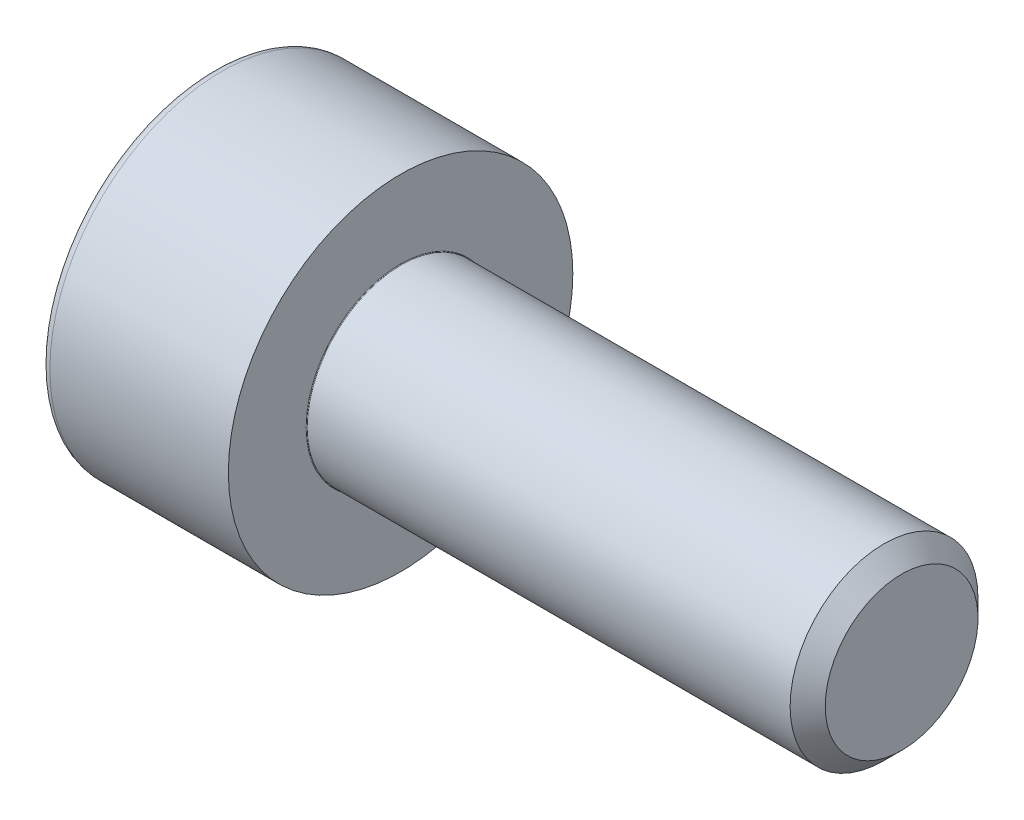
ISO-10303-21;
HEADER;
FILE_DESCRIPTION(('STEP AP214'),'2;1');
FILE_NAME('part.step','',(''),(''),'','','');
FILE_SCHEMA(('AUTOMOTIVE_DESIGN { 1 0 10303 214 1 1 1 1 }'));
ENDSEC;
DATA;
#1=APPLICATION_CONTEXT('core data for automotive mechanical design processes');
#2=APPLICATION_PROTOCOL_DEFINITION('international standard','automotive_design',2000,#1);
#3=PRODUCT_CONTEXT('',#1,'mechanical');
#4=PRODUCT('Part','Part','',(#3));
#5=PRODUCT_RELATED_PRODUCT_CATEGORY('part','',(#4));
#6=PRODUCT_DEFINITION_FORMATION('','',#4);
#7=PRODUCT_DEFINITION_CONTEXT('part definition',#1,'design');
#8=PRODUCT_DEFINITION('design','',#6,#7);
#9=PRODUCT_DEFINITION_SHAPE('','',#8);
#10=(LENGTH_UNIT() NAMED_UNIT(*) SI_UNIT(.MILLI.,.METRE.));
#11=(NAMED_UNIT(*) PLANE_ANGLE_UNIT() SI_UNIT($,.RADIAN.));
#12=(NAMED_UNIT(*) SI_UNIT($,.STERADIAN.) SOLID_ANGLE_UNIT());
#13=UNCERTAINTY_MEASURE_WITH_UNIT(LENGTH_MEASURE(1.E-05),#10,'distance_accuracy_value','');
#14=(GEOMETRIC_REPRESENTATION_CONTEXT(3) GLOBAL_UNCERTAINTY_ASSIGNED_CONTEXT((#13)) GLOBAL_UNIT_ASSIGNED_CONTEXT((#10,
#11,#12)) REPRESENTATION_CONTEXT('',''));
#15=CARTESIAN_POINT('',(0.,0.,0.));
#16=DIRECTION('',(0.,0.,1.));
#17=DIRECTION('',(1.,0.,0.));
#18=AXIS2_PLACEMENT_3D('',#15,#16,#17);
#19=CARTESIAN_POINT('',(0.,0.,0.));
#20=DIRECTION('',(-1.,0.,0.));
#21=DIRECTION('',(0.,0.,1.));
#22=AXIS2_PLACEMENT_3D('',#19,#20,#21);
#23=PLANE('',#22);
#24=DIRECTION('',(0.,-0.5,0.866025403784438));
#25=VECTOR('',#24,1.);
#26=CARTESIAN_POINT('',(0.,1.47801668912544,0.));
#27=LINE('',#26,#25);
#28=CARTESIAN_POINT('',(0.,1.47801668912544,0.));
#29=VERTEX_POINT('',#28);
#30=CARTESIAN_POINT('',(0.,0.739008344562721,1.28));
#31=VERTEX_POINT('',#30);
#32=EDGE_CURVE('E265',#29,#31,#27,.T.);
#33=ORIENTED_EDGE('',*,*,#32,.T.);
#34=DIRECTION('',(0.,1.,0.));
#35=VECTOR('',#34,1.);
#36=CARTESIAN_POINT('',(0.,-0.739008344562722,1.28));
#37=LINE('',#36,#35);
#38=CARTESIAN_POINT('',(0.,-0.739008344562722,1.28));
#39=VERTEX_POINT('',#38);
#40=EDGE_CURVE('E137',#39,#31,#37,.T.);
#41=ORIENTED_EDGE('',*,*,#40,.F.);
#42=DIRECTION('',(0.,-0.500000000000001,-0.866025403784438));
#43=VECTOR('',#42,1.);
#44=CARTESIAN_POINT('',(0.,-0.739008344562722,1.28));
#45=LINE('',#44,#43);
#46=CARTESIAN_POINT('',(0.,-1.47801668912545,0.));
#47=VERTEX_POINT('',#46);
#48=EDGE_CURVE('E268',#39,#47,#45,.T.);
#49=ORIENTED_EDGE('',*,*,#48,.T.);
#50=DIRECTION('',(0.,0.5,-0.866025403784438));
#51=VECTOR('',#50,1.);
#52=CARTESIAN_POINT('',(0.,-1.47801668912545,0.));
#53=LINE('',#52,#51);
#54=CARTESIAN_POINT('',(0.,-0.739008344562723,-1.28));
#55=VERTEX_POINT('',#54);
#56=EDGE_CURVE('E271',#47,#55,#53,.T.);
#57=ORIENTED_EDGE('',*,*,#56,.T.);
#58=DIRECTION('',(0.,-1.,0.));
#59=VECTOR('',#58,1.);
#60=CARTESIAN_POINT('',(0.,0.739008344562719,-1.28));
#61=LINE('',#60,#59);
#62=CARTESIAN_POINT('',(0.,0.739008344562719,-1.28));
#63=VERTEX_POINT('',#62);
#64=EDGE_CURVE('E274',#63,#55,#61,.T.);
#65=ORIENTED_EDGE('',*,*,#64,.F.);
#66=DIRECTION('',(0.,-0.500000000000001,-0.866025403784438));
#67=VECTOR('',#66,1.);
#68=CARTESIAN_POINT('',(0.,1.47801668912544,0.));
#69=LINE('',#68,#67);
#70=EDGE_CURVE('E132',#29,#63,#69,.T.);
#71=ORIENTED_EDGE('',*,*,#70,.F.);
#72=EDGE_LOOP('',(#33,#41,#49,#57,#65,#71));
#73=FACE_BOUND('',#72,.T.);
#74=CARTESIAN_POINT('',(0.,0.,0.));
#75=DIRECTION('',(-1.,0.,0.));
#76=DIRECTION('',(0.,0.,1.));
#77=AXIS2_PLACEMENT_3D('',#74,#75,#76);
#78=CIRCLE('',#77,2.6);
#79=CARTESIAN_POINT('',(0.,0.,2.6));
#80=VERTEX_POINT('',#79);
#81=EDGE_CURVE('E49',#80,#80,#78,.T.);
#82=ORIENTED_EDGE('',*,*,#81,.T.);
#83=EDGE_LOOP('',(#82));
#84=FACE_BOUND('',#83,.T.);
#85=ADVANCED_FACE('F41',(#73,#84),#23,.T.);
#86=CARTESIAN_POINT('',(-31.75,0.,0.));
#87=DIRECTION('',(-1.,0.,0.));
#88=DIRECTION('',(0.,0.,1.));
#89=AXIS2_PLACEMENT_3D('',#86,#87,#88);
#90=CYLINDRICAL_SURFACE('',#89,2.75);
#91=CARTESIAN_POINT('',(0.149999999999997,0.,0.));
#92=DIRECTION('',(-1.,0.,0.));
#93=DIRECTION('',(0.,0.,1.));
#94=AXIS2_PLACEMENT_3D('',#91,#92,#93);
#95=CIRCLE('',#94,2.75);
#96=CARTESIAN_POINT('',(0.149999999999997,0.,2.75));
#97=VERTEX_POINT('',#96);
#98=EDGE_CURVE('E11',#97,#97,#95,.F.);
#99=ORIENTED_EDGE('',*,*,#98,.T.);
#100=EDGE_LOOP('',(#99));
#101=FACE_BOUND('',#100,.T.);
#102=CARTESIAN_POINT('',(3.,0.,0.));
#103=DIRECTION('',(-1.,0.,0.));
#104=DIRECTION('',(0.,0.,1.));
#105=AXIS2_PLACEMENT_3D('',#102,#103,#104);
#106=CIRCLE('',#105,2.75);
#107=CARTESIAN_POINT('',(3.,0.,2.75));
#108=VERTEX_POINT('',#107);
#109=EDGE_CURVE('E155',#108,#108,#106,.T.);
#110=ORIENTED_EDGE('',*,*,#109,.T.);
#111=EDGE_LOOP('',(#110));
#112=FACE_BOUND('',#111,.T.);
#113=ADVANCED_FACE('F180',(#101,#112),#90,.T.);
#114=CARTESIAN_POINT('',(3.,2.75,0.));
#115=DIRECTION('',(1.,0.,0.));
#116=DIRECTION('',(0.,0.,-1.));
#117=AXIS2_PLACEMENT_3D('',#114,#115,#116);
#118=PLANE('',#117);
#119=CARTESIAN_POINT('',(3.,0.,0.));
#120=DIRECTION('',(1.,0.,0.));
#121=DIRECTION('',(0.,0.,-1.));
#122=AXIS2_PLACEMENT_3D('',#119,#120,#121);
#123=CIRCLE('',#122,1.51);
#124=CARTESIAN_POINT('',(3.,0.,-1.51));
#125=VERTEX_POINT('',#124);
#126=EDGE_CURVE('E158',#125,#125,#123,.F.);
#127=ORIENTED_EDGE('',*,*,#126,.T.);
#128=EDGE_LOOP('',(#127));
#129=FACE_BOUND('',#128,.T.);
#130=ORIENTED_EDGE('',*,*,#109,.F.);
#131=EDGE_LOOP('',(#130));
#132=FACE_BOUND('',#131,.T.);
#133=ADVANCED_FACE('F185',(#129,#132),#118,.T.);
#134=CARTESIAN_POINT('',(-31.75,0.,0.));
#135=DIRECTION('',(-1.,0.,0.));
#136=DIRECTION('',(0.,0.,1.));
#137=AXIS2_PLACEMENT_3D('',#134,#135,#136);
#138=CYLINDRICAL_SURFACE('',#137,1.5);
#139=CARTESIAN_POINT('',(3.01,0.,0.));
#140=DIRECTION('',(1.,0.,0.));
#141=DIRECTION('',(0.,0.,-1.));
#142=AXIS2_PLACEMENT_3D('',#139,#140,#141);
#143=CIRCLE('',#142,1.5);
#144=CARTESIAN_POINT('',(3.01,0.,-1.5));
#145=VERTEX_POINT('',#144);
#146=EDGE_CURVE('E161',#145,#145,#143,.T.);
#147=ORIENTED_EDGE('',*,*,#146,.T.);
#148=EDGE_LOOP('',(#147));
#149=FACE_BOUND('',#148,.T.);
#150=CARTESIAN_POINT('',(10.7195,0.,0.));
#151=DIRECTION('',(-1.,0.,0.));
#152=DIRECTION('',(0.,0.,1.));
#153=AXIS2_PLACEMENT_3D('',#150,#151,#152);
#154=CIRCLE('',#153,1.5);
#155=CARTESIAN_POINT('',(10.7195,0.,1.5));
#156=VERTEX_POINT('',#155);
#157=EDGE_CURVE('E152',#156,#156,#154,.T.);
#158=ORIENTED_EDGE('',*,*,#157,.T.);
#159=EDGE_LOOP('',(#158));
#160=FACE_BOUND('',#159,.T.);
#161=ADVANCED_FACE('F191',(#149,#160),#138,.T.);
#162=CARTESIAN_POINT('',(11.,0.,0.));
#163=DIRECTION('',(-1.,0.,0.));
#164=DIRECTION('',(0.,0.,1.));
#165=AXIS2_PLACEMENT_3D('',#162,#163,#164);
#166=CONICAL_SURFACE('',#165,1.2195,0.785398163397467);
#167=ORIENTED_EDGE('',*,*,#157,.F.);
#168=EDGE_LOOP('',(#167));
#169=FACE_BOUND('',#168,.T.);
#170=CARTESIAN_POINT('',(11.,0.,0.));
#171=DIRECTION('',(-1.,0.,0.));
#172=DIRECTION('',(0.,0.,1.));
#173=AXIS2_PLACEMENT_3D('',#170,#171,#172);
#174=CIRCLE('',#173,1.2195);
#175=CARTESIAN_POINT('',(11.,0.,1.2195));
#176=VERTEX_POINT('',#175);
#177=EDGE_CURVE('E148',#176,#176,#174,.T.);
#178=ORIENTED_EDGE('',*,*,#177,.T.);
#179=EDGE_LOOP('',(#178));
#180=FACE_BOUND('',#179,.T.);
#181=ADVANCED_FACE('F195',(#169,#180),#166,.T.);
#182=CARTESIAN_POINT('',(11.,1.2195,0.));
#183=DIRECTION('',(1.,0.,0.));
#184=DIRECTION('',(0.,0.,-1.));
#185=AXIS2_PLACEMENT_3D('',#182,#183,#184);
#186=PLANE('',#185);
#187=ORIENTED_EDGE('',*,*,#177,.F.);
#188=EDGE_LOOP('',(#187));
#189=FACE_BOUND('',#188,.T.);
#190=ADVANCED_FACE('F177',(#189),#186,.T.);
#191=CARTESIAN_POINT('',(3.01,0.,0.));
#192=DIRECTION('',(1.,0.,0.));
#193=DIRECTION('',(0.,0.,-1.));
#194=AXIS2_PLACEMENT_3D('',#191,#192,#193);
#195=TOROIDAL_SURFACE('',#194,1.51,0.01);
#196=ORIENTED_EDGE('',*,*,#146,.F.);
#197=EDGE_LOOP('',(#196));
#198=FACE_BOUND('',#197,.T.);
#199=ORIENTED_EDGE('',*,*,#126,.F.);
#200=EDGE_LOOP('',(#199));
#201=FACE_BOUND('',#200,.T.);
#202=ADVANCED_FACE('F168',(#198,#201),#195,.F.);
#203=CARTESIAN_POINT('',(0.149999999999997,0.,0.));
#204=DIRECTION('',(-1.,0.,0.));
#205=DIRECTION('',(0.,0.,1.));
#206=AXIS2_PLACEMENT_3D('',#203,#204,#205);
#207=TOROIDAL_SURFACE('',#206,2.6,0.15);
#208=ORIENTED_EDGE('',*,*,#98,.F.);
#209=EDGE_LOOP('',(#208));
#210=FACE_BOUND('',#209,.T.);
#211=ORIENTED_EDGE('',*,*,#81,.F.);
#212=EDGE_LOOP('',(#211));
#213=FACE_BOUND('',#212,.T.);
#214=ADVANCED_FACE('F43',(#210,#213),#207,.T.);
#215=CARTESIAN_POINT('',(1.3,1.47801668912544,0.));
#216=DIRECTION('',(0.,-0.866025403784438,-0.5));
#217=DIRECTION('',(0.,0.5,-0.866025403784439));
#218=AXIS2_PLACEMENT_3D('',#215,#216,#217);
#219=PLANE('',#218);
#220=ORIENTED_EDGE('',*,*,#32,.F.);
#221=DIRECTION('',(-1.,0.,0.));
#222=VECTOR('',#221,1.);
#223=CARTESIAN_POINT('',(1.3,1.47801668912544,0.));
#224=LINE('',#223,#222);
#225=CARTESIAN_POINT('',(1.3,1.47801668912544,0.));
#226=VERTEX_POINT('',#225);
#227=EDGE_CURVE('E255',#226,#29,#224,.T.);
#228=ORIENTED_EDGE('',*,*,#227,.F.);
#229=DIRECTION('',(0.,-0.5,0.866025403784438));
#230=VECTOR('',#229,1.);
#231=CARTESIAN_POINT('',(1.3,1.47801668912544,0.));
#232=LINE('',#231,#230);
#233=CARTESIAN_POINT('',(1.3,1.10851251684408,0.64));
#234=VERTEX_POINT('',#233);
#235=EDGE_CURVE('E124',#226,#234,#232,.T.);
#236=ORIENTED_EDGE('',*,*,#235,.T.);
#237=CARTESIAN_POINT('',(1.3,0.739008344562721,1.28));
#238=VERTEX_POINT('',#237);
#239=EDGE_CURVE('E115',#234,#238,#232,.T.);
#240=ORIENTED_EDGE('',*,*,#239,.T.);
#241=DIRECTION('',(-1.,0.,0.));
#242=VECTOR('',#241,1.);
#243=CARTESIAN_POINT('',(1.3,0.739008344562721,1.28));
#244=LINE('',#243,#242);
#245=EDGE_CURVE('E129',#238,#31,#244,.T.);
#246=ORIENTED_EDGE('',*,*,#245,.T.);
#247=EDGE_LOOP('',(#220,#228,#236,#240,#246));
#248=FACE_BOUND('',#247,.T.);
#249=ADVANCED_FACE('F128',(#248),#219,.T.);
#250=CARTESIAN_POINT('',(1.3,-0.739008344562722,1.28));
#251=DIRECTION('',(0.,0.,1.));
#252=DIRECTION('',(0.,-1.,0.));
#253=AXIS2_PLACEMENT_3D('',#250,#251,#252);
#254=PLANE('',#253);
#255=ORIENTED_EDGE('',*,*,#40,.T.);
#256=ORIENTED_EDGE('',*,*,#245,.F.);
#257=DIRECTION('',(0.,1.,0.));
#258=VECTOR('',#257,1.);
#259=CARTESIAN_POINT('',(1.3,-0.739008344562722,1.28));
#260=LINE('',#259,#258);
#261=CARTESIAN_POINT('',(1.3,0.,1.28));
#262=VERTEX_POINT('',#261);
#263=EDGE_CURVE('E112',#262,#238,#260,.T.);
#264=ORIENTED_EDGE('',*,*,#263,.F.);
#265=CARTESIAN_POINT('',(1.3,-0.739008344562722,1.28));
#266=VERTEX_POINT('',#265);
#267=EDGE_CURVE('E123',#266,#262,#260,.T.);
#268=ORIENTED_EDGE('',*,*,#267,.F.);
#269=DIRECTION('',(-1.,0.,0.));
#270=VECTOR('',#269,1.);
#271=CARTESIAN_POINT('',(1.3,-0.739008344562722,1.28));
#272=LINE('',#271,#270);
#273=EDGE_CURVE('E139',#266,#39,#272,.T.);
#274=ORIENTED_EDGE('',*,*,#273,.T.);
#275=EDGE_LOOP('',(#255,#256,#264,#268,#274));
#276=FACE_BOUND('',#275,.T.);
#277=ADVANCED_FACE('F134',(#276),#254,.F.);
#278=CARTESIAN_POINT('',(1.3,-0.739008344562722,1.28));
#279=DIRECTION('',(0.,0.866025403784438,-0.500000000000001));
#280=DIRECTION('',(0.,0.500000000000001,0.866025403784438));
#281=AXIS2_PLACEMENT_3D('',#278,#279,#280);
#282=PLANE('',#281);
#283=ORIENTED_EDGE('',*,*,#48,.F.);
#284=ORIENTED_EDGE('',*,*,#273,.F.);
#285=DIRECTION('',(0.,-0.500000000000001,-0.866025403784438));
#286=VECTOR('',#285,1.);
#287=CARTESIAN_POINT('',(1.3,-0.739008344562722,1.28));
#288=LINE('',#287,#286);
#289=CARTESIAN_POINT('',(1.3,-1.10851251684408,0.640000000000003));
#290=VERTEX_POINT('',#289);
#291=EDGE_CURVE('E294',#266,#290,#288,.T.);
#292=ORIENTED_EDGE('',*,*,#291,.T.);
#293=CARTESIAN_POINT('',(1.3,-1.47801668912545,0.));
#294=VERTEX_POINT('',#293);
#295=EDGE_CURVE('E283',#290,#294,#288,.T.);
#296=ORIENTED_EDGE('',*,*,#295,.T.);
#297=DIRECTION('',(-1.,0.,0.));
#298=VECTOR('',#297,1.);
#299=CARTESIAN_POINT('',(1.3,-1.47801668912545,0.));
#300=LINE('',#299,#298);
#301=EDGE_CURVE('E144',#294,#47,#300,.T.);
#302=ORIENTED_EDGE('',*,*,#301,.T.);
#303=EDGE_LOOP('',(#283,#284,#292,#296,#302));
#304=FACE_BOUND('',#303,.T.);
#305=ADVANCED_FACE('F209',(#304),#282,.T.);
#306=CARTESIAN_POINT('',(1.3,-1.47801668912545,0.));
#307=DIRECTION('',(0.,0.866025403784438,0.5));
#308=DIRECTION('',(0.,-0.5,0.866025403784439));
#309=AXIS2_PLACEMENT_3D('',#306,#307,#308);
#310=PLANE('',#309);
#311=ORIENTED_EDGE('',*,*,#56,.F.);
#312=ORIENTED_EDGE('',*,*,#301,.F.);
#313=DIRECTION('',(0.,0.5,-0.866025403784438));
#314=VECTOR('',#313,1.);
#315=CARTESIAN_POINT('',(1.3,-1.47801668912545,0.));
#316=LINE('',#315,#314);
#317=CARTESIAN_POINT('',(1.3,-1.10851251684408,-0.640000000000001));
#318=VERTEX_POINT('',#317);
#319=EDGE_CURVE('E261',#294,#318,#316,.T.);
#320=ORIENTED_EDGE('',*,*,#319,.T.);
#321=CARTESIAN_POINT('',(1.3,-0.739008344562723,-1.28));
#322=VERTEX_POINT('',#321);
#323=EDGE_CURVE('E293',#318,#322,#316,.T.);
#324=ORIENTED_EDGE('',*,*,#323,.T.);
#325=DIRECTION('',(-1.,0.,0.));
#326=VECTOR('',#325,1.);
#327=CARTESIAN_POINT('',(1.3,-0.739008344562723,-1.28));
#328=LINE('',#327,#326);
#329=EDGE_CURVE('E254',#322,#55,#328,.T.);
#330=ORIENTED_EDGE('',*,*,#329,.T.);
#331=EDGE_LOOP('',(#311,#312,#320,#324,#330));
#332=FACE_BOUND('',#331,.T.);
#333=ADVANCED_FACE('F212',(#332),#310,.T.);
#334=CARTESIAN_POINT('',(1.3,0.739008344562719,-1.28));
#335=DIRECTION('',(0.,0.,-1.));
#336=DIRECTION('',(0.,1.,0.));
#337=AXIS2_PLACEMENT_3D('',#334,#335,#336);
#338=PLANE('',#337);
#339=ORIENTED_EDGE('',*,*,#64,.T.);
#340=ORIENTED_EDGE('',*,*,#329,.F.);
#341=DIRECTION('',(0.,-1.,0.));
#342=VECTOR('',#341,1.);
#343=CARTESIAN_POINT('',(1.3,0.739008344562719,-1.28));
#344=LINE('',#343,#342);
#345=CARTESIAN_POINT('',(1.3,0.,-1.28));
#346=VERTEX_POINT('',#345);
#347=EDGE_CURVE('E258',#346,#322,#344,.T.);
#348=ORIENTED_EDGE('',*,*,#347,.F.);
#349=CARTESIAN_POINT('',(1.3,0.739008344562719,-1.28));
#350=VERTEX_POINT('',#349);
#351=EDGE_CURVE('E56',#350,#346,#344,.T.);
#352=ORIENTED_EDGE('',*,*,#351,.F.);
#353=DIRECTION('',(-1.,0.,0.));
#354=VECTOR('',#353,1.);
#355=CARTESIAN_POINT('',(1.3,0.739008344562719,-1.28));
#356=LINE('',#355,#354);
#357=EDGE_CURVE('E251',#350,#63,#356,.T.);
#358=ORIENTED_EDGE('',*,*,#357,.T.);
#359=EDGE_LOOP('',(#339,#340,#348,#352,#358));
#360=FACE_BOUND('',#359,.T.);
#361=ADVANCED_FACE('F216',(#360),#338,.F.);
#362=CARTESIAN_POINT('',(1.3,1.47801668912544,0.));
#363=DIRECTION('',(0.,0.866025403784438,-0.500000000000001));
#364=DIRECTION('',(0.,0.500000000000001,0.866025403784438));
#365=AXIS2_PLACEMENT_3D('',#362,#363,#364);
#366=PLANE('',#365);
#367=ORIENTED_EDGE('',*,*,#70,.T.);
#368=ORIENTED_EDGE('',*,*,#357,.F.);
#369=DIRECTION('',(0.,-0.500000000000001,-0.866025403784438));
#370=VECTOR('',#369,1.);
#371=CARTESIAN_POINT('',(1.3,1.47801668912544,0.));
#372=LINE('',#371,#370);
#373=CARTESIAN_POINT('',(1.3,1.10851251684408,-0.640000000000002));
#374=VERTEX_POINT('',#373);
#375=EDGE_CURVE('E241',#374,#350,#372,.T.);
#376=ORIENTED_EDGE('',*,*,#375,.F.);
#377=EDGE_CURVE('E247',#226,#374,#372,.T.);
#378=ORIENTED_EDGE('',*,*,#377,.F.);
#379=ORIENTED_EDGE('',*,*,#227,.T.);
#380=EDGE_LOOP('',(#367,#368,#376,#378,#379));
#381=FACE_BOUND('',#380,.T.);
#382=ADVANCED_FACE('F220',(#381),#366,.F.);
#383=CARTESIAN_POINT('',(1.3,1.47801668912544,0.));
#384=DIRECTION('',(1.,0.,0.));
#385=DIRECTION('',(0.,0.,-1.));
#386=AXIS2_PLACEMENT_3D('',#383,#384,#385);
#387=PLANE('',#386);
#388=ORIENTED_EDGE('',*,*,#347,.T.);
#389=ORIENTED_EDGE('',*,*,#323,.F.);
#390=CARTESIAN_POINT('',(1.3,0.,0.));
#391=DIRECTION('',(-1.,0.,0.));
#392=DIRECTION('',(0.,0.,1.));
#393=AXIS2_PLACEMENT_3D('',#390,#391,#392);
#394=CIRCLE('',#393,1.28);
#395=EDGE_CURVE('E289',#346,#318,#394,.T.);
#396=ORIENTED_EDGE('',*,*,#395,.F.);
#397=EDGE_LOOP('',(#388,#389,#396));
#398=FACE_BOUND('',#397,.T.);
#399=ADVANCED_FACE('F224',(#398),#387,.F.);
#400=ORIENTED_EDGE('',*,*,#319,.F.);
#401=ORIENTED_EDGE('',*,*,#295,.F.);
#402=EDGE_CURVE('E142',#318,#290,#394,.T.);
#403=ORIENTED_EDGE('',*,*,#402,.F.);
#404=EDGE_LOOP('',(#400,#401,#403));
#405=FACE_BOUND('',#404,.T.);
#406=ADVANCED_FACE('F227',(#405),#387,.F.);
#407=ORIENTED_EDGE('',*,*,#291,.F.);
#408=ORIENTED_EDGE('',*,*,#267,.T.);
#409=EDGE_CURVE('E138',#290,#262,#394,.T.);
#410=ORIENTED_EDGE('',*,*,#409,.F.);
#411=EDGE_LOOP('',(#407,#408,#410));
#412=FACE_BOUND('',#411,.T.);
#413=ADVANCED_FACE('F232',(#412),#387,.F.);
#414=ORIENTED_EDGE('',*,*,#263,.T.);
#415=ORIENTED_EDGE('',*,*,#239,.F.);
#416=EDGE_CURVE('E118',#262,#234,#394,.T.);
#417=ORIENTED_EDGE('',*,*,#416,.F.);
#418=EDGE_LOOP('',(#414,#415,#417));
#419=FACE_BOUND('',#418,.T.);
#420=ADVANCED_FACE('F114',(#419),#387,.F.);
#421=ORIENTED_EDGE('',*,*,#235,.F.);
#422=ORIENTED_EDGE('',*,*,#377,.T.);
#423=EDGE_CURVE('E149',#234,#374,#394,.T.);
#424=ORIENTED_EDGE('',*,*,#423,.F.);
#425=EDGE_LOOP('',(#421,#422,#424));
#426=FACE_BOUND('',#425,.T.);
#427=ADVANCED_FACE('F235',(#426),#387,.F.);
#428=ORIENTED_EDGE('',*,*,#375,.T.);
#429=ORIENTED_EDGE('',*,*,#351,.T.);
#430=EDGE_CURVE('E244',#374,#346,#394,.T.);
#431=ORIENTED_EDGE('',*,*,#430,.F.);
#432=EDGE_LOOP('',(#428,#429,#431));
#433=FACE_BOUND('',#432,.T.);
#434=ADVANCED_FACE('F205',(#433),#387,.F.);
#435=CARTESIAN_POINT('',(1.3,0.,0.));
#436=DIRECTION('',(-1.,0.,0.));
#437=DIRECTION('',(0.,0.,1.));
#438=AXIS2_PLACEMENT_3D('',#435,#436,#437);
#439=CONICAL_SURFACE('',#438,1.28,1.04719755119659);
#440=CARTESIAN_POINT('',(2.03900834456273,0.,0.));
#441=VERTEX_POINT('',#440);
#442=VERTEX_LOOP('',#441);
#443=FACE_BOUND('',#442,.T.);
#444=ORIENTED_EDGE('',*,*,#416,.T.);
#445=ORIENTED_EDGE('',*,*,#423,.T.);
#446=ORIENTED_EDGE('',*,*,#430,.T.);
#447=ORIENTED_EDGE('',*,*,#395,.T.);
#448=ORIENTED_EDGE('',*,*,#402,.T.);
#449=ORIENTED_EDGE('',*,*,#409,.T.);
#450=EDGE_LOOP('',(#444,#445,#446,#447,#448,#449));
#451=FACE_BOUND('',#450,.T.);
#452=ADVANCED_FACE('F203',(#443,#451),#439,.F.);
#453=CLOSED_SHELL('',(#85,#113,#133,#161,#181,#190,#202,#214,#249,#277,#305,#333,#361,#382,#399,
#406,#413,#420,#427,#434,#452));
#454=MANIFOLD_SOLID_BREP('B2',#453);
#455=ADVANCED_BREP_SHAPE_REPRESENTATION('',(#18,#454),#14);
#456=SHAPE_DEFINITION_REPRESENTATION(#9,#455);
ENDSEC;
END-ISO-10303-21;
